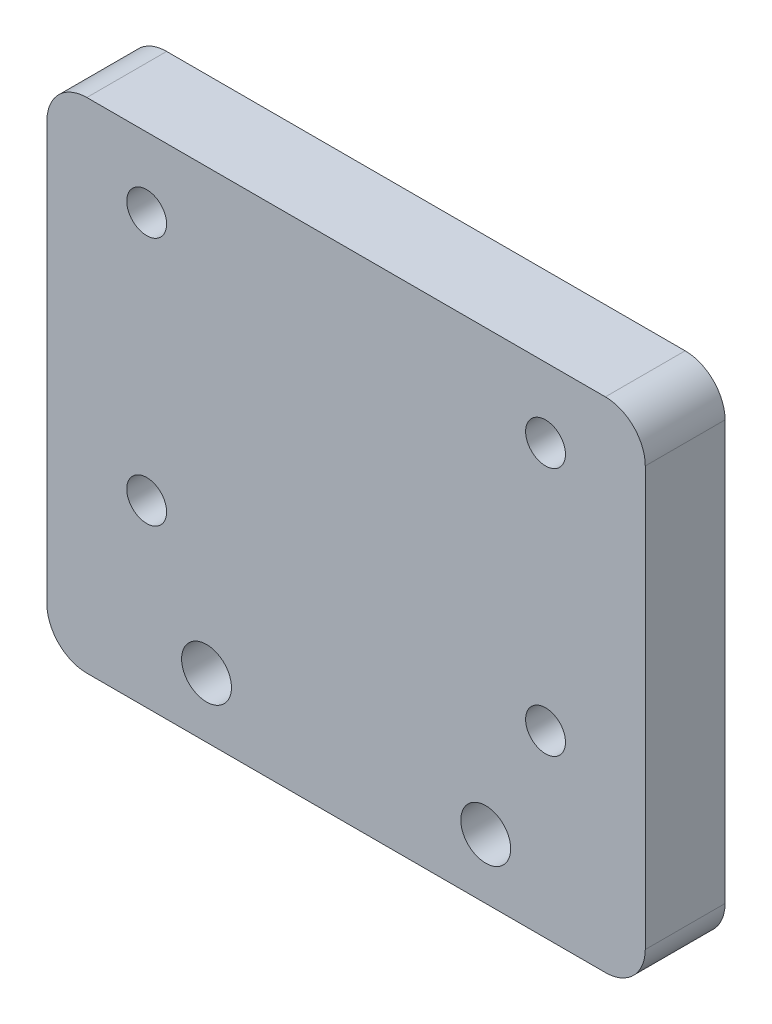
ISO-10303-21;
HEADER;
FILE_DESCRIPTION(('STEP AP214'),'2;1');
FILE_NAME('part.step','',(''),(''),'','','');
FILE_SCHEMA(('AUTOMOTIVE_DESIGN { 1 0 10303 214 1 1 1 1 }'));
ENDSEC;
DATA;
#1=APPLICATION_CONTEXT('core data for automotive mechanical design processes');
#2=APPLICATION_PROTOCOL_DEFINITION('international standard','automotive_design',2000,#1);
#3=PRODUCT_CONTEXT('',#1,'mechanical');
#4=PRODUCT('Part','Part','',(#3));
#5=PRODUCT_RELATED_PRODUCT_CATEGORY('part','',(#4));
#6=PRODUCT_DEFINITION_FORMATION('','',#4);
#7=PRODUCT_DEFINITION_CONTEXT('part definition',#1,'design');
#8=PRODUCT_DEFINITION('design','',#6,#7);
#9=PRODUCT_DEFINITION_SHAPE('','',#8);
#10=(LENGTH_UNIT() NAMED_UNIT(*) SI_UNIT(.MILLI.,.METRE.));
#11=(NAMED_UNIT(*) PLANE_ANGLE_UNIT() SI_UNIT($,.RADIAN.));
#12=(NAMED_UNIT(*) SI_UNIT($,.STERADIAN.) SOLID_ANGLE_UNIT());
#13=UNCERTAINTY_MEASURE_WITH_UNIT(LENGTH_MEASURE(1.E-05),#10,'distance_accuracy_value','');
#14=(GEOMETRIC_REPRESENTATION_CONTEXT(3) GLOBAL_UNCERTAINTY_ASSIGNED_CONTEXT((#13)) GLOBAL_UNIT_ASSIGNED_CONTEXT((#10,
#11,#12)) REPRESENTATION_CONTEXT('',''));
#15=CARTESIAN_POINT('',(0.,0.,0.));
#16=DIRECTION('',(0.,0.,1.));
#17=DIRECTION('',(1.,0.,0.));
#18=AXIS2_PLACEMENT_3D('',#15,#16,#17);
#19=CARTESIAN_POINT('',(0.,0.,4.));
#20=DIRECTION('',(0.,0.,-1.));
#21=DIRECTION('',(-1.,0.,0.));
#22=AXIS2_PLACEMENT_3D('',#19,#20,#21);
#23=PLANE('',#22);
#24=DIRECTION('',(1.,0.,0.));
#25=VECTOR('',#24,1.);
#26=CARTESIAN_POINT('',(-15.,-12.5,4.));
#27=LINE('',#26,#25);
#28=CARTESIAN_POINT('',(-13.,-12.5,4.));
#29=VERTEX_POINT('',#28);
#30=CARTESIAN_POINT('',(13.,-12.5,4.));
#31=VERTEX_POINT('',#30);
#32=EDGE_CURVE('E150',#29,#31,#27,.T.);
#33=ORIENTED_EDGE('',*,*,#32,.T.);
#34=CARTESIAN_POINT('',(13.,-10.5,4.));
#35=DIRECTION('',(0.,0.,-1.));
#36=DIRECTION('',(-1.,0.,0.));
#37=AXIS2_PLACEMENT_3D('',#34,#35,#36);
#38=CIRCLE('',#37,2.);
#39=CARTESIAN_POINT('',(15.,-10.5,4.));
#40=VERTEX_POINT('',#39);
#41=EDGE_CURVE('E179',#31,#40,#38,.F.);
#42=ORIENTED_EDGE('',*,*,#41,.T.);
#43=DIRECTION('',(0.,1.,0.));
#44=VECTOR('',#43,1.);
#45=CARTESIAN_POINT('',(15.,-12.5,4.));
#46=LINE('',#45,#44);
#47=CARTESIAN_POINT('',(15.,10.5,4.));
#48=VERTEX_POINT('',#47);
#49=EDGE_CURVE('E128',#40,#48,#46,.T.);
#50=ORIENTED_EDGE('',*,*,#49,.T.);
#51=CARTESIAN_POINT('',(13.,10.5,4.));
#52=DIRECTION('',(0.,0.,-1.));
#53=DIRECTION('',(-1.,0.,0.));
#54=AXIS2_PLACEMENT_3D('',#51,#52,#53);
#55=CIRCLE('',#54,2.);
#56=CARTESIAN_POINT('',(13.,12.5,4.));
#57=VERTEX_POINT('',#56);
#58=EDGE_CURVE('E173',#48,#57,#55,.F.);
#59=ORIENTED_EDGE('',*,*,#58,.T.);
#60=DIRECTION('',(-1.,0.,0.));
#61=VECTOR('',#60,1.);
#62=CARTESIAN_POINT('',(-15.,12.5,4.));
#63=LINE('',#62,#61);
#64=CARTESIAN_POINT('',(-13.,12.5,4.));
#65=VERTEX_POINT('',#64);
#66=EDGE_CURVE('E192',#57,#65,#63,.T.);
#67=ORIENTED_EDGE('',*,*,#66,.T.);
#68=CARTESIAN_POINT('',(-13.,10.5,4.));
#69=DIRECTION('',(0.,0.,-1.));
#70=DIRECTION('',(-1.,0.,0.));
#71=AXIS2_PLACEMENT_3D('',#68,#69,#70);
#72=CIRCLE('',#71,2.);
#73=CARTESIAN_POINT('',(-15.,10.5,4.));
#74=VERTEX_POINT('',#73);
#75=EDGE_CURVE('E62',#65,#74,#72,.F.);
#76=ORIENTED_EDGE('',*,*,#75,.T.);
#77=DIRECTION('',(0.,-1.,0.));
#78=VECTOR('',#77,1.);
#79=CARTESIAN_POINT('',(-15.,-12.5,4.));
#80=LINE('',#79,#78);
#81=CARTESIAN_POINT('',(-15.,-10.5,4.));
#82=VERTEX_POINT('',#81);
#83=EDGE_CURVE('E199',#74,#82,#80,.T.);
#84=ORIENTED_EDGE('',*,*,#83,.T.);
#85=CARTESIAN_POINT('',(-13.,-10.5,4.));
#86=DIRECTION('',(0.,0.,-1.));
#87=DIRECTION('',(-1.,0.,0.));
#88=AXIS2_PLACEMENT_3D('',#85,#86,#87);
#89=CIRCLE('',#88,2.);
#90=EDGE_CURVE('E176',#82,#29,#89,.F.);
#91=ORIENTED_EDGE('',*,*,#90,.T.);
#92=EDGE_LOOP('',(#33,#42,#50,#59,#67,#76,#84,#91));
#93=FACE_BOUND('',#92,.T.);
#94=CARTESIAN_POINT('',(-7.,-9.50000000000001,4.));
#95=DIRECTION('',(0.,0.,1.));
#96=DIRECTION('',(1.,0.,0.));
#97=AXIS2_PLACEMENT_3D('',#94,#95,#96);
#98=CIRCLE('',#97,1.25);
#99=CARTESIAN_POINT('',(-5.75,-9.50000000000001,4.));
#100=VERTEX_POINT('',#99);
#101=EDGE_CURVE('E139',#100,#100,#98,.T.);
#102=ORIENTED_EDGE('',*,*,#101,.F.);
#103=EDGE_LOOP('',(#102));
#104=FACE_BOUND('',#103,.T.);
#105=CARTESIAN_POINT('',(7.,-9.50000000000001,4.));
#106=DIRECTION('',(0.,0.,1.));
#107=DIRECTION('',(1.,0.,0.));
#108=AXIS2_PLACEMENT_3D('',#105,#106,#107);
#109=CIRCLE('',#108,1.25);
#110=CARTESIAN_POINT('',(8.25,-9.50000000000001,4.));
#111=VERTEX_POINT('',#110);
#112=EDGE_CURVE('E218',#111,#111,#109,.T.);
#113=ORIENTED_EDGE('',*,*,#112,.F.);
#114=EDGE_LOOP('',(#113));
#115=FACE_BOUND('',#114,.T.);
#116=CARTESIAN_POINT('',(-10.,-3.5,4.));
#117=DIRECTION('',(0.,0.,1.));
#118=DIRECTION('',(1.,0.,0.));
#119=AXIS2_PLACEMENT_3D('',#116,#117,#118);
#120=CIRCLE('',#119,1.);
#121=CARTESIAN_POINT('',(-9.,-3.5,4.));
#122=VERTEX_POINT('',#121);
#123=EDGE_CURVE('E224',#122,#122,#120,.T.);
#124=ORIENTED_EDGE('',*,*,#123,.F.);
#125=EDGE_LOOP('',(#124));
#126=FACE_BOUND('',#125,.T.);
#127=CARTESIAN_POINT('',(-10.,9.,4.));
#128=DIRECTION('',(0.,0.,1.));
#129=DIRECTION('',(1.,0.,0.));
#130=AXIS2_PLACEMENT_3D('',#127,#128,#129);
#131=CIRCLE('',#130,1.);
#132=CARTESIAN_POINT('',(-9.,9.,4.));
#133=VERTEX_POINT('',#132);
#134=EDGE_CURVE('E232',#133,#133,#131,.T.);
#135=ORIENTED_EDGE('',*,*,#134,.F.);
#136=EDGE_LOOP('',(#135));
#137=FACE_BOUND('',#136,.T.);
#138=CARTESIAN_POINT('',(10.,9.,4.));
#139=DIRECTION('',(0.,0.,1.));
#140=DIRECTION('',(1.,0.,0.));
#141=AXIS2_PLACEMENT_3D('',#138,#139,#140);
#142=CIRCLE('',#141,1.);
#143=CARTESIAN_POINT('',(11.,9.,4.));
#144=VERTEX_POINT('',#143);
#145=EDGE_CURVE('E240',#144,#144,#142,.T.);
#146=ORIENTED_EDGE('',*,*,#145,.F.);
#147=EDGE_LOOP('',(#146));
#148=FACE_BOUND('',#147,.T.);
#149=CARTESIAN_POINT('',(10.,-3.5,4.));
#150=DIRECTION('',(0.,0.,1.));
#151=DIRECTION('',(1.,0.,0.));
#152=AXIS2_PLACEMENT_3D('',#149,#150,#151);
#153=CIRCLE('',#152,1.);
#154=CARTESIAN_POINT('',(11.,-3.5,4.));
#155=VERTEX_POINT('',#154);
#156=EDGE_CURVE('E248',#155,#155,#153,.T.);
#157=ORIENTED_EDGE('',*,*,#156,.F.);
#158=EDGE_LOOP('',(#157));
#159=FACE_BOUND('',#158,.T.);
#160=ADVANCED_FACE('F39',(#93,#104,#115,#126,#137,#148,#159),#23,.F.);
#161=CARTESIAN_POINT('',(0.,0.,0.));
#162=DIRECTION('',(0.,0.,-1.));
#163=DIRECTION('',(-1.,0.,0.));
#164=AXIS2_PLACEMENT_3D('',#161,#162,#163);
#165=PLANE('',#164);
#166=CARTESIAN_POINT('',(10.,9.,0.));
#167=DIRECTION('',(0.,0.,1.));
#168=DIRECTION('',(1.,0.,0.));
#169=AXIS2_PLACEMENT_3D('',#166,#167,#168);
#170=CIRCLE('',#169,1.);
#171=CARTESIAN_POINT('',(11.,9.,0.));
#172=VERTEX_POINT('',#171);
#173=EDGE_CURVE('E244',#172,#172,#170,.T.);
#174=ORIENTED_EDGE('',*,*,#173,.T.);
#175=EDGE_LOOP('',(#174));
#176=FACE_BOUND('',#175,.T.);
#177=CARTESIAN_POINT('',(-10.,-3.5,0.));
#178=DIRECTION('',(0.,0.,1.));
#179=DIRECTION('',(1.,0.,0.));
#180=AXIS2_PLACEMENT_3D('',#177,#178,#179);
#181=CIRCLE('',#180,1.);
#182=CARTESIAN_POINT('',(-9.,-3.5,0.));
#183=VERTEX_POINT('',#182);
#184=EDGE_CURVE('E228',#183,#183,#181,.T.);
#185=ORIENTED_EDGE('',*,*,#184,.T.);
#186=EDGE_LOOP('',(#185));
#187=FACE_BOUND('',#186,.T.);
#188=CARTESIAN_POINT('',(-7.,-9.50000000000001,0.));
#189=DIRECTION('',(0.,0.,1.));
#190=DIRECTION('',(1.,0.,0.));
#191=AXIS2_PLACEMENT_3D('',#188,#189,#190);
#192=CIRCLE('',#191,1.25);
#193=CARTESIAN_POINT('',(-5.75,-9.50000000000001,0.));
#194=VERTEX_POINT('',#193);
#195=EDGE_CURVE('E147',#194,#194,#192,.T.);
#196=ORIENTED_EDGE('',*,*,#195,.T.);
#197=EDGE_LOOP('',(#196));
#198=FACE_BOUND('',#197,.T.);
#199=DIRECTION('',(0.,1.,0.));
#200=VECTOR('',#199,1.);
#201=CARTESIAN_POINT('',(15.,-12.5,0.));
#202=LINE('',#201,#200);
#203=CARTESIAN_POINT('',(15.,-10.5,0.));
#204=VERTEX_POINT('',#203);
#205=CARTESIAN_POINT('',(15.,10.5,0.));
#206=VERTEX_POINT('',#205);
#207=EDGE_CURVE('E125',#204,#206,#202,.T.);
#208=ORIENTED_EDGE('',*,*,#207,.F.);
#209=CARTESIAN_POINT('',(13.,-10.5,0.));
#210=DIRECTION('',(0.,0.,-1.));
#211=DIRECTION('',(-1.,0.,0.));
#212=AXIS2_PLACEMENT_3D('',#209,#210,#211);
#213=CIRCLE('',#212,2.);
#214=CARTESIAN_POINT('',(13.,-12.5,0.));
#215=VERTEX_POINT('',#214);
#216=EDGE_CURVE('E107',#204,#215,#213,.T.);
#217=ORIENTED_EDGE('',*,*,#216,.T.);
#218=DIRECTION('',(1.,0.,0.));
#219=VECTOR('',#218,1.);
#220=CARTESIAN_POINT('',(-15.,-12.5,0.));
#221=LINE('',#220,#219);
#222=CARTESIAN_POINT('',(-13.,-12.5,0.));
#223=VERTEX_POINT('',#222);
#224=EDGE_CURVE('E155',#223,#215,#221,.T.);
#225=ORIENTED_EDGE('',*,*,#224,.F.);
#226=CARTESIAN_POINT('',(-13.,-10.5,0.));
#227=DIRECTION('',(0.,0.,-1.));
#228=DIRECTION('',(-1.,0.,0.));
#229=AXIS2_PLACEMENT_3D('',#226,#227,#228);
#230=CIRCLE('',#229,2.);
#231=CARTESIAN_POINT('',(-15.,-10.5,0.));
#232=VERTEX_POINT('',#231);
#233=EDGE_CURVE('E119',#223,#232,#230,.T.);
#234=ORIENTED_EDGE('',*,*,#233,.T.);
#235=DIRECTION('',(0.,-1.,0.));
#236=VECTOR('',#235,1.);
#237=CARTESIAN_POINT('',(-15.,-12.5,0.));
#238=LINE('',#237,#236);
#239=CARTESIAN_POINT('',(-15.,10.5,0.));
#240=VERTEX_POINT('',#239);
#241=EDGE_CURVE('E144',#240,#232,#238,.T.);
#242=ORIENTED_EDGE('',*,*,#241,.F.);
#243=CARTESIAN_POINT('',(-13.,10.5,0.));
#244=DIRECTION('',(0.,0.,-1.));
#245=DIRECTION('',(-1.,0.,0.));
#246=AXIS2_PLACEMENT_3D('',#243,#244,#245);
#247=CIRCLE('',#246,2.);
#248=CARTESIAN_POINT('',(-13.,12.5,0.));
#249=VERTEX_POINT('',#248);
#250=EDGE_CURVE('E130',#240,#249,#247,.T.);
#251=ORIENTED_EDGE('',*,*,#250,.T.);
#252=DIRECTION('',(-1.,0.,0.));
#253=VECTOR('',#252,1.);
#254=CARTESIAN_POINT('',(-15.,12.5,0.));
#255=LINE('',#254,#253);
#256=CARTESIAN_POINT('',(13.,12.5,0.));
#257=VERTEX_POINT('',#256);
#258=EDGE_CURVE('E138',#257,#249,#255,.T.);
#259=ORIENTED_EDGE('',*,*,#258,.F.);
#260=CARTESIAN_POINT('',(13.,10.5,0.));
#261=DIRECTION('',(0.,0.,-1.));
#262=DIRECTION('',(-1.,0.,0.));
#263=AXIS2_PLACEMENT_3D('',#260,#261,#262);
#264=CIRCLE('',#263,2.);
#265=EDGE_CURVE('E136',#257,#206,#264,.T.);
#266=ORIENTED_EDGE('',*,*,#265,.T.);
#267=EDGE_LOOP('',(#208,#217,#225,#234,#242,#251,#259,#266));
#268=FACE_BOUND('',#267,.T.);
#269=CARTESIAN_POINT('',(7.,-9.50000000000001,0.));
#270=DIRECTION('',(0.,0.,1.));
#271=DIRECTION('',(1.,0.,0.));
#272=AXIS2_PLACEMENT_3D('',#269,#270,#271);
#273=CIRCLE('',#272,1.25);
#274=CARTESIAN_POINT('',(8.25,-9.50000000000001,0.));
#275=VERTEX_POINT('',#274);
#276=EDGE_CURVE('E220',#275,#275,#273,.T.);
#277=ORIENTED_EDGE('',*,*,#276,.T.);
#278=EDGE_LOOP('',(#277));
#279=FACE_BOUND('',#278,.T.);
#280=CARTESIAN_POINT('',(-10.,9.,0.));
#281=DIRECTION('',(0.,0.,1.));
#282=DIRECTION('',(1.,0.,0.));
#283=AXIS2_PLACEMENT_3D('',#280,#281,#282);
#284=CIRCLE('',#283,1.);
#285=CARTESIAN_POINT('',(-9.,9.,0.));
#286=VERTEX_POINT('',#285);
#287=EDGE_CURVE('E236',#286,#286,#284,.T.);
#288=ORIENTED_EDGE('',*,*,#287,.T.);
#289=EDGE_LOOP('',(#288));
#290=FACE_BOUND('',#289,.T.);
#291=CARTESIAN_POINT('',(10.,-3.5,0.));
#292=DIRECTION('',(0.,0.,1.));
#293=DIRECTION('',(1.,0.,0.));
#294=AXIS2_PLACEMENT_3D('',#291,#292,#293);
#295=CIRCLE('',#294,1.);
#296=CARTESIAN_POINT('',(11.,-3.5,0.));
#297=VERTEX_POINT('',#296);
#298=EDGE_CURVE('E252',#297,#297,#295,.T.);
#299=ORIENTED_EDGE('',*,*,#298,.T.);
#300=EDGE_LOOP('',(#299));
#301=FACE_BOUND('',#300,.T.);
#302=ADVANCED_FACE('F133',(#176,#187,#198,#268,#279,#290,#301),#165,.T.);
#303=CARTESIAN_POINT('',(15.,-12.5,4.));
#304=DIRECTION('',(-1.,0.,0.));
#305=DIRECTION('',(0.,0.,1.));
#306=AXIS2_PLACEMENT_3D('',#303,#304,#305);
#307=PLANE('',#306);
#308=ORIENTED_EDGE('',*,*,#49,.F.);
#309=DIRECTION('',(0.,0.,-1.));
#310=VECTOR('',#309,1.);
#311=CARTESIAN_POINT('',(15.,-10.5,4.));
#312=LINE('',#311,#310);
#313=EDGE_CURVE('E111',#40,#204,#312,.T.);
#314=ORIENTED_EDGE('',*,*,#313,.T.);
#315=ORIENTED_EDGE('',*,*,#207,.T.);
#316=DIRECTION('',(0.,0.,-1.));
#317=VECTOR('',#316,1.);
#318=CARTESIAN_POINT('',(15.,10.5,4.));
#319=LINE('',#318,#317);
#320=EDGE_CURVE('E131',#206,#48,#319,.F.);
#321=ORIENTED_EDGE('',*,*,#320,.T.);
#322=EDGE_LOOP('',(#308,#314,#315,#321));
#323=FACE_BOUND('',#322,.T.);
#324=ADVANCED_FACE('F124',(#323),#307,.F.);
#325=CARTESIAN_POINT('',(-15.,12.5,4.));
#326=DIRECTION('',(0.,-1.,0.));
#327=DIRECTION('',(0.,0.,-1.));
#328=AXIS2_PLACEMENT_3D('',#325,#326,#327);
#329=PLANE('',#328);
#330=ORIENTED_EDGE('',*,*,#66,.F.);
#331=DIRECTION('',(0.,0.,-1.));
#332=VECTOR('',#331,1.);
#333=CARTESIAN_POINT('',(13.,12.5,4.));
#334=LINE('',#333,#332);
#335=EDGE_CURVE('E11',#57,#257,#334,.T.);
#336=ORIENTED_EDGE('',*,*,#335,.T.);
#337=ORIENTED_EDGE('',*,*,#258,.T.);
#338=DIRECTION('',(0.,0.,-1.));
#339=VECTOR('',#338,1.);
#340=CARTESIAN_POINT('',(-13.,12.5,4.));
#341=LINE('',#340,#339);
#342=EDGE_CURVE('E48',#249,#65,#341,.F.);
#343=ORIENTED_EDGE('',*,*,#342,.T.);
#344=EDGE_LOOP('',(#330,#336,#337,#343));
#345=FACE_BOUND('',#344,.T.);
#346=ADVANCED_FACE('F191',(#345),#329,.F.);
#347=CARTESIAN_POINT('',(-15.,-12.5,4.));
#348=DIRECTION('',(1.,0.,0.));
#349=DIRECTION('',(0.,0.,-1.));
#350=AXIS2_PLACEMENT_3D('',#347,#348,#349);
#351=PLANE('',#350);
#352=ORIENTED_EDGE('',*,*,#241,.T.);
#353=DIRECTION('',(0.,0.,-1.));
#354=VECTOR('',#353,1.);
#355=CARTESIAN_POINT('',(-15.,-10.5,4.));
#356=LINE('',#355,#354);
#357=EDGE_CURVE('E55',#232,#82,#356,.F.);
#358=ORIENTED_EDGE('',*,*,#357,.T.);
#359=ORIENTED_EDGE('',*,*,#83,.F.);
#360=DIRECTION('',(0.,0.,-1.));
#361=VECTOR('',#360,1.);
#362=CARTESIAN_POINT('',(-15.,10.5,4.));
#363=LINE('',#362,#361);
#364=EDGE_CURVE('E182',#74,#240,#363,.T.);
#365=ORIENTED_EDGE('',*,*,#364,.T.);
#366=EDGE_LOOP('',(#352,#358,#359,#365));
#367=FACE_BOUND('',#366,.T.);
#368=ADVANCED_FACE('F203',(#367),#351,.F.);
#369=CARTESIAN_POINT('',(-15.,-12.5,4.));
#370=DIRECTION('',(0.,1.,0.));
#371=DIRECTION('',(0.,0.,1.));
#372=AXIS2_PLACEMENT_3D('',#369,#370,#371);
#373=PLANE('',#372);
#374=ORIENTED_EDGE('',*,*,#224,.T.);
#375=DIRECTION('',(0.,0.,-1.));
#376=VECTOR('',#375,1.);
#377=CARTESIAN_POINT('',(13.,-12.5,4.));
#378=LINE('',#377,#376);
#379=EDGE_CURVE('E112',#215,#31,#378,.F.);
#380=ORIENTED_EDGE('',*,*,#379,.T.);
#381=ORIENTED_EDGE('',*,*,#32,.F.);
#382=DIRECTION('',(0.,0.,-1.));
#383=VECTOR('',#382,1.);
#384=CARTESIAN_POINT('',(-13.,-12.5,4.));
#385=LINE('',#384,#383);
#386=EDGE_CURVE('E118',#29,#223,#385,.T.);
#387=ORIENTED_EDGE('',*,*,#386,.T.);
#388=EDGE_LOOP('',(#374,#380,#381,#387));
#389=FACE_BOUND('',#388,.T.);
#390=ADVANCED_FACE('F210',(#389),#373,.F.);
#391=CARTESIAN_POINT('',(-7.,-9.50000000000001,4.));
#392=DIRECTION('',(0.,0.,-1.));
#393=DIRECTION('',(-1.,0.,0.));
#394=AXIS2_PLACEMENT_3D('',#391,#392,#393);
#395=CYLINDRICAL_SURFACE('',#394,1.25);
#396=ORIENTED_EDGE('',*,*,#101,.T.);
#397=EDGE_LOOP('',(#396));
#398=FACE_BOUND('',#397,.T.);
#399=ORIENTED_EDGE('',*,*,#195,.F.);
#400=EDGE_LOOP('',(#399));
#401=FACE_BOUND('',#400,.T.);
#402=ADVANCED_FACE('F271',(#398,#401),#395,.F.);
#403=CARTESIAN_POINT('',(7.,-9.50000000000001,4.));
#404=DIRECTION('',(0.,0.,-1.));
#405=DIRECTION('',(-1.,0.,0.));
#406=AXIS2_PLACEMENT_3D('',#403,#404,#405);
#407=CYLINDRICAL_SURFACE('',#406,1.25);
#408=ORIENTED_EDGE('',*,*,#112,.T.);
#409=EDGE_LOOP('',(#408));
#410=FACE_BOUND('',#409,.T.);
#411=ORIENTED_EDGE('',*,*,#276,.F.);
#412=EDGE_LOOP('',(#411));
#413=FACE_BOUND('',#412,.T.);
#414=ADVANCED_FACE('F383',(#410,#413),#407,.F.);
#415=CARTESIAN_POINT('',(-10.,-3.5,4.));
#416=DIRECTION('',(0.,0.,-1.));
#417=DIRECTION('',(-1.,0.,0.));
#418=AXIS2_PLACEMENT_3D('',#415,#416,#417);
#419=CYLINDRICAL_SURFACE('',#418,1.);
#420=ORIENTED_EDGE('',*,*,#123,.T.);
#421=EDGE_LOOP('',(#420));
#422=FACE_BOUND('',#421,.T.);
#423=ORIENTED_EDGE('',*,*,#184,.F.);
#424=EDGE_LOOP('',(#423));
#425=FACE_BOUND('',#424,.T.);
#426=ADVANCED_FACE('F373',(#422,#425),#419,.F.);
#427=CARTESIAN_POINT('',(-10.,9.,4.));
#428=DIRECTION('',(0.,0.,-1.));
#429=DIRECTION('',(-1.,0.,0.));
#430=AXIS2_PLACEMENT_3D('',#427,#428,#429);
#431=CYLINDRICAL_SURFACE('',#430,1.);
#432=ORIENTED_EDGE('',*,*,#134,.T.);
#433=EDGE_LOOP('',(#432));
#434=FACE_BOUND('',#433,.T.);
#435=ORIENTED_EDGE('',*,*,#287,.F.);
#436=EDGE_LOOP('',(#435));
#437=FACE_BOUND('',#436,.T.);
#438=ADVANCED_FACE('F363',(#434,#437),#431,.F.);
#439=CARTESIAN_POINT('',(10.,9.,4.));
#440=DIRECTION('',(0.,0.,-1.));
#441=DIRECTION('',(-1.,0.,0.));
#442=AXIS2_PLACEMENT_3D('',#439,#440,#441);
#443=CYLINDRICAL_SURFACE('',#442,1.);
#444=ORIENTED_EDGE('',*,*,#145,.T.);
#445=EDGE_LOOP('',(#444));
#446=FACE_BOUND('',#445,.T.);
#447=ORIENTED_EDGE('',*,*,#173,.F.);
#448=EDGE_LOOP('',(#447));
#449=FACE_BOUND('',#448,.T.);
#450=ADVANCED_FACE('F354',(#446,#449),#443,.F.);
#451=CARTESIAN_POINT('',(10.,-3.5,4.));
#452=DIRECTION('',(0.,0.,-1.));
#453=DIRECTION('',(-1.,0.,0.));
#454=AXIS2_PLACEMENT_3D('',#451,#452,#453);
#455=CYLINDRICAL_SURFACE('',#454,1.);
#456=ORIENTED_EDGE('',*,*,#156,.T.);
#457=EDGE_LOOP('',(#456));
#458=FACE_BOUND('',#457,.T.);
#459=ORIENTED_EDGE('',*,*,#298,.F.);
#460=EDGE_LOOP('',(#459));
#461=FACE_BOUND('',#460,.T.);
#462=ADVANCED_FACE('F260',(#458,#461),#455,.F.);
#463=CARTESIAN_POINT('',(13.,-10.5,4.));
#464=DIRECTION('',(0.,0.,-1.));
#465=DIRECTION('',(-1.,0.,0.));
#466=AXIS2_PLACEMENT_3D('',#463,#464,#465);
#467=CYLINDRICAL_SURFACE('',#466,2.);
#468=ORIENTED_EDGE('',*,*,#41,.F.);
#469=ORIENTED_EDGE('',*,*,#379,.F.);
#470=ORIENTED_EDGE('',*,*,#216,.F.);
#471=ORIENTED_EDGE('',*,*,#313,.F.);
#472=EDGE_LOOP('',(#468,#469,#470,#471));
#473=FACE_BOUND('',#472,.T.);
#474=ADVANCED_FACE('F110',(#473),#467,.T.);
#475=CARTESIAN_POINT('',(-13.,-10.5,4.));
#476=DIRECTION('',(0.,0.,-1.));
#477=DIRECTION('',(-1.,0.,0.));
#478=AXIS2_PLACEMENT_3D('',#475,#476,#477);
#479=CYLINDRICAL_SURFACE('',#478,2.);
#480=ORIENTED_EDGE('',*,*,#90,.F.);
#481=ORIENTED_EDGE('',*,*,#357,.F.);
#482=ORIENTED_EDGE('',*,*,#233,.F.);
#483=ORIENTED_EDGE('',*,*,#386,.F.);
#484=EDGE_LOOP('',(#480,#481,#482,#483));
#485=FACE_BOUND('',#484,.T.);
#486=ADVANCED_FACE('F207',(#485),#479,.T.);
#487=CARTESIAN_POINT('',(13.,10.5,4.));
#488=DIRECTION('',(0.,0.,-1.));
#489=DIRECTION('',(-1.,0.,0.));
#490=AXIS2_PLACEMENT_3D('',#487,#488,#489);
#491=CYLINDRICAL_SURFACE('',#490,2.);
#492=ORIENTED_EDGE('',*,*,#58,.F.);
#493=ORIENTED_EDGE('',*,*,#320,.F.);
#494=ORIENTED_EDGE('',*,*,#265,.F.);
#495=ORIENTED_EDGE('',*,*,#335,.F.);
#496=EDGE_LOOP('',(#492,#493,#494,#495));
#497=FACE_BOUND('',#496,.T.);
#498=ADVANCED_FACE('F285',(#497),#491,.T.);
#499=CARTESIAN_POINT('',(-13.,10.5,4.));
#500=DIRECTION('',(0.,0.,-1.));
#501=DIRECTION('',(-1.,0.,0.));
#502=AXIS2_PLACEMENT_3D('',#499,#500,#501);
#503=CYLINDRICAL_SURFACE('',#502,2.);
#504=ORIENTED_EDGE('',*,*,#75,.F.);
#505=ORIENTED_EDGE('',*,*,#342,.F.);
#506=ORIENTED_EDGE('',*,*,#250,.F.);
#507=ORIENTED_EDGE('',*,*,#364,.F.);
#508=EDGE_LOOP('',(#504,#505,#506,#507));
#509=FACE_BOUND('',#508,.T.);
#510=ADVANCED_FACE('F41',(#509),#503,.T.);
#511=CLOSED_SHELL('',(#160,#302,#324,#346,#368,#390,#402,#414,#426,#438,#450,#462,#474,#486,
#498,#510));
#512=MANIFOLD_SOLID_BREP('B2',#511);
#513=ADVANCED_BREP_SHAPE_REPRESENTATION('',(#18,#512),#14);
#514=SHAPE_DEFINITION_REPRESENTATION(#9,#513);
ENDSEC;
END-ISO-10303-21;
